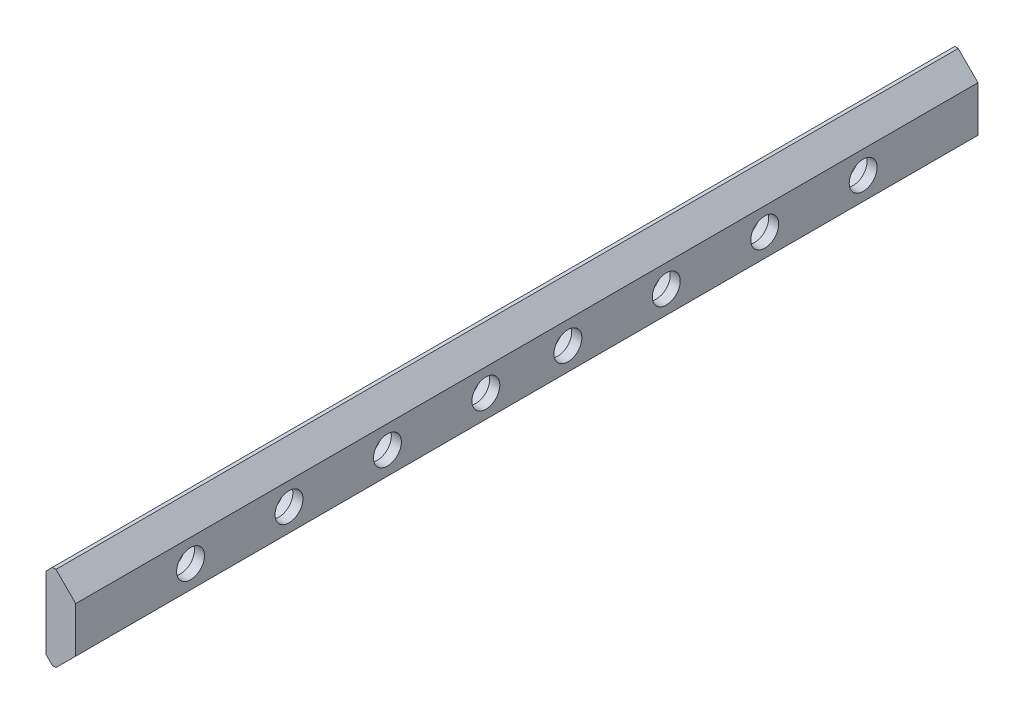
ISO-10303-21;
HEADER;
FILE_DESCRIPTION(('STEP AP214'),'2;1');
FILE_NAME('part.step','',(''),(''),'','','');
FILE_SCHEMA(('AUTOMOTIVE_DESIGN { 1 0 10303 214 1 1 1 1 }'));
ENDSEC;
DATA;
#1=APPLICATION_CONTEXT('core data for automotive mechanical design processes');
#2=APPLICATION_PROTOCOL_DEFINITION('international standard','automotive_design',2000,#1);
#3=PRODUCT_CONTEXT('',#1,'mechanical');
#4=PRODUCT('Part','Part','',(#3));
#5=PRODUCT_RELATED_PRODUCT_CATEGORY('part','',(#4));
#6=PRODUCT_DEFINITION_FORMATION('','',#4);
#7=PRODUCT_DEFINITION_CONTEXT('part definition',#1,'design');
#8=PRODUCT_DEFINITION('design','',#6,#7);
#9=PRODUCT_DEFINITION_SHAPE('','',#8);
#10=(LENGTH_UNIT() NAMED_UNIT(*) SI_UNIT(.MILLI.,.METRE.));
#11=(NAMED_UNIT(*) PLANE_ANGLE_UNIT() SI_UNIT($,.RADIAN.));
#12=(NAMED_UNIT(*) SI_UNIT($,.STERADIAN.) SOLID_ANGLE_UNIT());
#13=UNCERTAINTY_MEASURE_WITH_UNIT(LENGTH_MEASURE(1.E-05),#10,'distance_accuracy_value','');
#14=(GEOMETRIC_REPRESENTATION_CONTEXT(3) GLOBAL_UNCERTAINTY_ASSIGNED_CONTEXT((#13)) GLOBAL_UNIT_ASSIGNED_CONTEXT((#10,
#11,#12)) REPRESENTATION_CONTEXT('',''));
#15=CARTESIAN_POINT('',(0.,0.,0.));
#16=DIRECTION('',(0.,0.,1.));
#17=DIRECTION('',(1.,0.,0.));
#18=AXIS2_PLACEMENT_3D('',#15,#16,#17);
#19=CARTESIAN_POINT('',(-1.8125,5.4,110.));
#20=DIRECTION('',(1.,0.,0.));
#21=DIRECTION('',(0.,1.,0.));
#22=AXIS2_PLACEMENT_3D('',#19,#20,#21);
#23=PLANE('',#22);
#24=CARTESIAN_POINT('',(-1.8125,0.,50.));
#25=DIRECTION('',(-1.,0.,0.));
#26=DIRECTION('',(0.,0.,1.));
#27=AXIS2_PLACEMENT_3D('',#24,#25,#26);
#28=CIRCLE('',#27,3.5);
#29=CARTESIAN_POINT('',(-1.8125,0.,53.5));
#30=VERTEX_POINT('',#29);
#31=EDGE_CURVE('E124',#30,#30,#28,.T.);
#32=ORIENTED_EDGE('',*,*,#31,.F.);
#33=EDGE_LOOP('',(#32));
#34=FACE_BOUND('',#33,.T.);
#35=CARTESIAN_POINT('',(-1.8125,0.,38.));
#36=DIRECTION('',(-1.,0.,0.));
#37=DIRECTION('',(0.,0.,1.));
#38=AXIS2_PLACEMENT_3D('',#35,#36,#37);
#39=CIRCLE('',#38,3.5);
#40=CARTESIAN_POINT('',(-1.8125,0.,41.5));
#41=VERTEX_POINT('',#40);
#42=EDGE_CURVE('E200',#41,#41,#39,.T.);
#43=ORIENTED_EDGE('',*,*,#42,.F.);
#44=EDGE_LOOP('',(#43));
#45=FACE_BOUND('',#44,.T.);
#46=CARTESIAN_POINT('',(-1.8125,-1.67912299302914E-13,26.));
#47=DIRECTION('',(-1.,0.,0.));
#48=DIRECTION('',(0.,0.,1.));
#49=AXIS2_PLACEMENT_3D('',#46,#47,#48);
#50=CIRCLE('',#49,3.5);
#51=CARTESIAN_POINT('',(-1.8125,-1.67912299302914E-13,29.5));
#52=VERTEX_POINT('',#51);
#53=EDGE_CURVE('E194',#52,#52,#50,.T.);
#54=ORIENTED_EDGE('',*,*,#53,.F.);
#55=EDGE_LOOP('',(#54));
#56=FACE_BOUND('',#55,.T.);
#57=CARTESIAN_POINT('',(-1.8125,-2.51707851435149E-13,14.));
#58=DIRECTION('',(-1.,0.,0.));
#59=DIRECTION('',(0.,0.,1.));
#60=AXIS2_PLACEMENT_3D('',#57,#58,#59);
#61=CIRCLE('',#60,3.5);
#62=CARTESIAN_POINT('',(-1.8125,-2.51707851435149E-13,17.5));
#63=VERTEX_POINT('',#62);
#64=EDGE_CURVE('E188',#63,#63,#61,.T.);
#65=ORIENTED_EDGE('',*,*,#64,.F.);
#66=EDGE_LOOP('',(#65));
#67=FACE_BOUND('',#66,.T.);
#68=CARTESIAN_POINT('',(-1.8125,0.,72.));
#69=DIRECTION('',(-1.,0.,0.));
#70=DIRECTION('',(0.,0.,1.));
#71=AXIS2_PLACEMENT_3D('',#68,#69,#70);
#72=CIRCLE('',#71,3.5);
#73=CARTESIAN_POINT('',(-1.8125,0.,75.5));
#74=VERTEX_POINT('',#73);
#75=EDGE_CURVE('E182',#74,#74,#72,.T.);
#76=ORIENTED_EDGE('',*,*,#75,.F.);
#77=EDGE_LOOP('',(#76));
#78=FACE_BOUND('',#77,.T.);
#79=CARTESIAN_POINT('',(-1.8125,-1.60809347867859E-13,84.));
#80=DIRECTION('',(-1.,0.,0.));
#81=DIRECTION('',(0.,0.,1.));
#82=AXIS2_PLACEMENT_3D('',#79,#80,#81);
#83=CIRCLE('',#82,3.5);
#84=CARTESIAN_POINT('',(-1.8125,-1.60809347867859E-13,87.5));
#85=VERTEX_POINT('',#84);
#86=EDGE_CURVE('E176',#85,#85,#83,.T.);
#87=ORIENTED_EDGE('',*,*,#86,.F.);
#88=EDGE_LOOP('',(#87));
#89=FACE_BOUND('',#88,.T.);
#90=CARTESIAN_POINT('',(-1.8125,-2.41665747682141E-13,96.));
#91=DIRECTION('',(-1.,0.,0.));
#92=DIRECTION('',(0.,0.,1.));
#93=AXIS2_PLACEMENT_3D('',#90,#91,#92);
#94=CIRCLE('',#93,3.5);
#95=CARTESIAN_POINT('',(-1.8125,-2.41665747682141E-13,99.5));
#96=VERTEX_POINT('',#95);
#97=EDGE_CURVE('E170',#96,#96,#94,.T.);
#98=ORIENTED_EDGE('',*,*,#97,.F.);
#99=EDGE_LOOP('',(#98));
#100=FACE_BOUND('',#99,.T.);
#101=CARTESIAN_POINT('',(-1.8125,0.,60.));
#102=DIRECTION('',(-1.,0.,0.));
#103=DIRECTION('',(0.,0.,1.));
#104=AXIS2_PLACEMENT_3D('',#101,#102,#103);
#105=CIRCLE('',#104,3.5);
#106=CARTESIAN_POINT('',(-1.8125,0.,63.5));
#107=VERTEX_POINT('',#106);
#108=EDGE_CURVE('E164',#107,#107,#105,.T.);
#109=ORIENTED_EDGE('',*,*,#108,.F.);
#110=EDGE_LOOP('',(#109));
#111=FACE_BOUND('',#110,.T.);
#112=DIRECTION('',(0.,-1.,0.));
#113=VECTOR('',#112,1.);
#114=CARTESIAN_POINT('',(-1.8125,5.4,110.));
#115=LINE('',#114,#113);
#116=CARTESIAN_POINT('',(-1.8125,4.40000000000001,110.));
#117=VERTEX_POINT('',#116);
#118=CARTESIAN_POINT('',(-1.8125,-4.40000000000001,110.));
#119=VERTEX_POINT('',#118);
#120=EDGE_CURVE('E122',#117,#119,#115,.T.);
#121=ORIENTED_EDGE('',*,*,#120,.F.);
#122=DIRECTION('',(0.,0.,1.));
#123=VECTOR('',#122,1.);
#124=CARTESIAN_POINT('',(-1.8125,4.40000000000001,0.));
#125=LINE('',#124,#123);
#126=CARTESIAN_POINT('',(-1.8125,4.40000000000001,0.));
#127=VERTEX_POINT('',#126);
#128=EDGE_CURVE('E109',#127,#117,#125,.T.);
#129=ORIENTED_EDGE('',*,*,#128,.F.);
#130=DIRECTION('',(0.,-1.,0.));
#131=VECTOR('',#130,1.);
#132=CARTESIAN_POINT('',(-1.8125,5.4,0.));
#133=LINE('',#132,#131);
#134=CARTESIAN_POINT('',(-1.8125,-4.4,0.));
#135=VERTEX_POINT('',#134);
#136=EDGE_CURVE('E120',#127,#135,#133,.T.);
#137=ORIENTED_EDGE('',*,*,#136,.T.);
#138=DIRECTION('',(0.,0.,1.));
#139=VECTOR('',#138,1.);
#140=CARTESIAN_POINT('',(-1.8125,-4.40000000000001,0.));
#141=LINE('',#140,#139);
#142=EDGE_CURVE('E309',#135,#119,#141,.T.);
#143=ORIENTED_EDGE('',*,*,#142,.T.);
#144=EDGE_LOOP('',(#121,#129,#137,#143));
#145=FACE_BOUND('',#144,.T.);
#146=ADVANCED_FACE('F39',(#34,#45,#56,#67,#78,#89,#100,#111,#145),#23,.F.);
#147=CARTESIAN_POINT('',(1.8125,-2.775,110.));
#148=DIRECTION('',(-0.707106781186548,0.707106781186547,0.));
#149=DIRECTION('',(-0.707106781186547,-0.707106781186548,0.));
#150=AXIS2_PLACEMENT_3D('',#147,#148,#149);
#151=PLANE('',#150);
#152=DIRECTION('',(0.707106781186547,0.707106781186548,0.));
#153=VECTOR('',#152,1.);
#154=CARTESIAN_POINT('',(1.8125,-2.775,110.));
#155=LINE('',#154,#153);
#156=CARTESIAN_POINT('',(-0.60036796564403,-5.18786796564403,110.));
#157=VERTEX_POINT('',#156);
#158=CARTESIAN_POINT('',(1.8125,-2.775,110.));
#159=VERTEX_POINT('',#158);
#160=EDGE_CURVE('E223',#157,#159,#155,.T.);
#161=ORIENTED_EDGE('',*,*,#160,.F.);
#162=DIRECTION('',(0.,0.,-1.));
#163=VECTOR('',#162,1.);
#164=CARTESIAN_POINT('',(-0.600367965644031,-5.18786796564403,110.));
#165=LINE('',#164,#163);
#166=CARTESIAN_POINT('',(-0.60036796564403,-5.18786796564403,0.));
#167=VERTEX_POINT('',#166);
#168=EDGE_CURVE('E158',#157,#167,#165,.T.);
#169=ORIENTED_EDGE('',*,*,#168,.T.);
#170=DIRECTION('',(0.707106781186547,0.707106781186548,0.));
#171=VECTOR('',#170,1.);
#172=CARTESIAN_POINT('',(1.8125,-2.775,0.));
#173=LINE('',#172,#171);
#174=CARTESIAN_POINT('',(1.8125,-2.775,0.));
#175=VERTEX_POINT('',#174);
#176=EDGE_CURVE('E132',#167,#175,#173,.T.);
#177=ORIENTED_EDGE('',*,*,#176,.T.);
#178=DIRECTION('',(0.,0.,-1.));
#179=VECTOR('',#178,1.);
#180=CARTESIAN_POINT('',(1.8125,-2.775,110.));
#181=LINE('',#180,#179);
#182=EDGE_CURVE('E155',#159,#175,#181,.T.);
#183=ORIENTED_EDGE('',*,*,#182,.F.);
#184=EDGE_LOOP('',(#161,#169,#177,#183));
#185=FACE_BOUND('',#184,.T.);
#186=ADVANCED_FACE('F329',(#185),#151,.F.);
#187=CARTESIAN_POINT('',(1.8125,2.775,110.));
#188=DIRECTION('',(-1.,0.,0.));
#189=DIRECTION('',(0.,-1.,0.));
#190=AXIS2_PLACEMENT_3D('',#187,#188,#189);
#191=PLANE('',#190);
#192=CARTESIAN_POINT('',(1.8125,0.,50.));
#193=DIRECTION('',(-1.,0.,0.));
#194=DIRECTION('',(0.,-1.,0.));
#195=AXIS2_PLACEMENT_3D('',#192,#193,#194);
#196=CIRCLE('',#195,1.7);
#197=CARTESIAN_POINT('',(1.8125,-1.7,50.));
#198=VERTEX_POINT('',#197);
#199=EDGE_CURVE('E196',#198,#198,#196,.T.);
#200=ORIENTED_EDGE('',*,*,#199,.T.);
#201=EDGE_LOOP('',(#200));
#202=FACE_BOUND('',#201,.T.);
#203=CARTESIAN_POINT('',(1.8125,0.,38.));
#204=DIRECTION('',(-1.,0.,0.));
#205=DIRECTION('',(0.,-1.,0.));
#206=AXIS2_PLACEMENT_3D('',#203,#204,#205);
#207=CIRCLE('',#206,1.7);
#208=CARTESIAN_POINT('',(1.8125,-1.70000000000008,38.));
#209=VERTEX_POINT('',#208);
#210=EDGE_CURVE('E190',#209,#209,#207,.T.);
#211=ORIENTED_EDGE('',*,*,#210,.T.);
#212=EDGE_LOOP('',(#211));
#213=FACE_BOUND('',#212,.T.);
#214=CARTESIAN_POINT('',(1.8125,-1.67912299302914E-13,26.));
#215=DIRECTION('',(-1.,0.,0.));
#216=DIRECTION('',(0.,-1.,0.));
#217=AXIS2_PLACEMENT_3D('',#214,#215,#216);
#218=CIRCLE('',#217,1.7);
#219=CARTESIAN_POINT('',(1.8125,-1.70000000000017,26.));
#220=VERTEX_POINT('',#219);
#221=EDGE_CURVE('E184',#220,#220,#218,.T.);
#222=ORIENTED_EDGE('',*,*,#221,.T.);
#223=EDGE_LOOP('',(#222));
#224=FACE_BOUND('',#223,.T.);
#225=CARTESIAN_POINT('',(1.8125,-2.51707851435149E-13,14.));
#226=DIRECTION('',(-1.,0.,0.));
#227=DIRECTION('',(0.,-1.,0.));
#228=AXIS2_PLACEMENT_3D('',#225,#226,#227);
#229=CIRCLE('',#228,1.7);
#230=CARTESIAN_POINT('',(1.8125,-1.70000000000025,14.));
#231=VERTEX_POINT('',#230);
#232=EDGE_CURVE('E178',#231,#231,#229,.T.);
#233=ORIENTED_EDGE('',*,*,#232,.T.);
#234=EDGE_LOOP('',(#233));
#235=FACE_BOUND('',#234,.T.);
#236=CARTESIAN_POINT('',(1.8125,0.,72.));
#237=DIRECTION('',(-1.,0.,0.));
#238=DIRECTION('',(0.,-1.,0.));
#239=AXIS2_PLACEMENT_3D('',#236,#237,#238);
#240=CIRCLE('',#239,1.7);
#241=CARTESIAN_POINT('',(1.8125,-1.70000000000008,72.));
#242=VERTEX_POINT('',#241);
#243=EDGE_CURVE('E172',#242,#242,#240,.T.);
#244=ORIENTED_EDGE('',*,*,#243,.T.);
#245=EDGE_LOOP('',(#244));
#246=FACE_BOUND('',#245,.T.);
#247=CARTESIAN_POINT('',(1.8125,-1.60809347867859E-13,84.));
#248=DIRECTION('',(-1.,0.,0.));
#249=DIRECTION('',(0.,-1.,0.));
#250=AXIS2_PLACEMENT_3D('',#247,#248,#249);
#251=CIRCLE('',#250,1.7);
#252=CARTESIAN_POINT('',(1.8125,-1.70000000000016,84.));
#253=VERTEX_POINT('',#252);
#254=EDGE_CURVE('E166',#253,#253,#251,.T.);
#255=ORIENTED_EDGE('',*,*,#254,.T.);
#256=EDGE_LOOP('',(#255));
#257=FACE_BOUND('',#256,.T.);
#258=CARTESIAN_POINT('',(1.8125,-2.41665747682141E-13,96.));
#259=DIRECTION('',(-1.,0.,0.));
#260=DIRECTION('',(0.,-1.,0.));
#261=AXIS2_PLACEMENT_3D('',#258,#259,#260);
#262=CIRCLE('',#261,1.7);
#263=CARTESIAN_POINT('',(1.8125,-1.70000000000024,96.));
#264=VERTEX_POINT('',#263);
#265=EDGE_CURVE('E160',#264,#264,#262,.T.);
#266=ORIENTED_EDGE('',*,*,#265,.T.);
#267=EDGE_LOOP('',(#266));
#268=FACE_BOUND('',#267,.T.);
#269=CARTESIAN_POINT('',(1.8125,0.,60.));
#270=DIRECTION('',(-1.,0.,0.));
#271=DIRECTION('',(0.,-1.,0.));
#272=AXIS2_PLACEMENT_3D('',#269,#270,#271);
#273=CIRCLE('',#272,1.7);
#274=CARTESIAN_POINT('',(1.8125,-1.7,60.));
#275=VERTEX_POINT('',#274);
#276=EDGE_CURVE('E133',#275,#275,#273,.T.);
#277=ORIENTED_EDGE('',*,*,#276,.T.);
#278=EDGE_LOOP('',(#277));
#279=FACE_BOUND('',#278,.T.);
#280=DIRECTION('',(0.,1.,0.));
#281=VECTOR('',#280,1.);
#282=CARTESIAN_POINT('',(1.8125,2.775,0.));
#283=LINE('',#282,#281);
#284=CARTESIAN_POINT('',(1.8125,2.775,0.));
#285=VERTEX_POINT('',#284);
#286=EDGE_CURVE('E137',#175,#285,#283,.T.);
#287=ORIENTED_EDGE('',*,*,#286,.T.);
#288=DIRECTION('',(0.,0.,-1.));
#289=VECTOR('',#288,1.);
#290=CARTESIAN_POINT('',(1.8125,2.775,110.));
#291=LINE('',#290,#289);
#292=CARTESIAN_POINT('',(1.8125,2.775,110.));
#293=VERTEX_POINT('',#292);
#294=EDGE_CURVE('E151',#293,#285,#291,.T.);
#295=ORIENTED_EDGE('',*,*,#294,.F.);
#296=DIRECTION('',(0.,1.,0.));
#297=VECTOR('',#296,1.);
#298=CARTESIAN_POINT('',(1.8125,2.775,110.));
#299=LINE('',#298,#297);
#300=EDGE_CURVE('E221',#159,#293,#299,.T.);
#301=ORIENTED_EDGE('',*,*,#300,.F.);
#302=ORIENTED_EDGE('',*,*,#182,.T.);
#303=EDGE_LOOP('',(#287,#295,#301,#302));
#304=FACE_BOUND('',#303,.T.);
#305=ADVANCED_FACE('F325',(#202,#213,#224,#235,#246,#257,#268,#279,#304),#191,.F.);
#306=CARTESIAN_POINT('',(-0.812499999999997,5.4,110.));
#307=DIRECTION('',(-0.707106781186548,-0.707106781186547,0.));
#308=DIRECTION('',(0.707106781186547,-0.707106781186548,0.));
#309=AXIS2_PLACEMENT_3D('',#306,#307,#308);
#310=PLANE('',#309);
#311=DIRECTION('',(-0.707106781186547,0.707106781186548,0.));
#312=VECTOR('',#311,1.);
#313=CARTESIAN_POINT('',(-0.812499999999997,5.4,0.));
#314=LINE('',#313,#312);
#315=CARTESIAN_POINT('',(-0.600367965644039,5.18786796564404,0.));
#316=VERTEX_POINT('',#315);
#317=EDGE_CURVE('E148',#285,#316,#314,.T.);
#318=ORIENTED_EDGE('',*,*,#317,.T.);
#319=DIRECTION('',(0.,0.,1.));
#320=VECTOR('',#319,1.);
#321=CARTESIAN_POINT('',(-0.600367965644039,5.18786796564404,110.));
#322=LINE('',#321,#320);
#323=CARTESIAN_POINT('',(-0.600367965644039,5.18786796564404,110.));
#324=VERTEX_POINT('',#323);
#325=EDGE_CURVE('E11',#316,#324,#322,.T.);
#326=ORIENTED_EDGE('',*,*,#325,.T.);
#327=DIRECTION('',(-0.707106781186547,0.707106781186548,0.));
#328=VECTOR('',#327,1.);
#329=CARTESIAN_POINT('',(-0.812499999999997,5.4,110.));
#330=LINE('',#329,#328);
#331=EDGE_CURVE('E143',#293,#324,#330,.T.);
#332=ORIENTED_EDGE('',*,*,#331,.F.);
#333=ORIENTED_EDGE('',*,*,#294,.T.);
#334=EDGE_LOOP('',(#318,#326,#332,#333));
#335=FACE_BOUND('',#334,.T.);
#336=ADVANCED_FACE('F321',(#335),#310,.F.);
#337=CARTESIAN_POINT('',(0.,0.,110.));
#338=DIRECTION('',(0.,0.,-1.));
#339=DIRECTION('',(-1.,0.,0.));
#340=AXIS2_PLACEMENT_3D('',#337,#338,#339);
#341=PLANE('',#340);
#342=DIRECTION('',(-0.70710678118655,0.707106781186545,0.));
#343=VECTOR('',#342,1.);
#344=CARTESIAN_POINT('',(-0.812499999999997,-5.4,110.));
#345=LINE('',#344,#343);
#346=CARTESIAN_POINT('',(-1.02463203435596,-5.18786796564403,110.));
#347=VERTEX_POINT('',#346);
#348=EDGE_CURVE('E312',#347,#119,#345,.T.);
#349=ORIENTED_EDGE('',*,*,#348,.F.);
#350=DIRECTION('',(-1.,0.,0.));
#351=VECTOR('',#350,1.);
#352=CARTESIAN_POINT('',(-0.600367965644032,-5.18786796564403,110.));
#353=LINE('',#352,#351);
#354=EDGE_CURVE('E216',#347,#157,#353,.F.);
#355=ORIENTED_EDGE('',*,*,#354,.T.);
#356=ORIENTED_EDGE('',*,*,#160,.T.);
#357=ORIENTED_EDGE('',*,*,#300,.T.);
#358=ORIENTED_EDGE('',*,*,#331,.T.);
#359=DIRECTION('',(1.,0.,0.));
#360=VECTOR('',#359,1.);
#361=CARTESIAN_POINT('',(-1.02463203435596,5.18786796564404,110.));
#362=LINE('',#361,#360);
#363=CARTESIAN_POINT('',(-1.02463203435596,5.18786796564404,110.));
#364=VERTEX_POINT('',#363);
#365=EDGE_CURVE('E55',#324,#364,#362,.F.);
#366=ORIENTED_EDGE('',*,*,#365,.T.);
#367=DIRECTION('',(0.707106781186551,0.707106781186544,0.));
#368=VECTOR('',#367,1.);
#369=CARTESIAN_POINT('',(-0.812499999999997,5.4,110.));
#370=LINE('',#369,#368);
#371=EDGE_CURVE('E114',#117,#364,#370,.T.);
#372=ORIENTED_EDGE('',*,*,#371,.F.);
#373=ORIENTED_EDGE('',*,*,#120,.T.);
#374=EDGE_LOOP('',(#349,#355,#356,#357,#358,#366,#372,#373));
#375=FACE_BOUND('',#374,.T.);
#376=ADVANCED_FACE('F337',(#375),#341,.F.);
#377=CARTESIAN_POINT('',(0.,0.,0.));
#378=DIRECTION('',(0.,0.,-1.));
#379=DIRECTION('',(-1.,0.,0.));
#380=AXIS2_PLACEMENT_3D('',#377,#378,#379);
#381=PLANE('',#380);
#382=ORIENTED_EDGE('',*,*,#176,.F.);
#383=DIRECTION('',(1.,0.,0.));
#384=VECTOR('',#383,1.);
#385=CARTESIAN_POINT('',(0.,-5.18786796564403,0.));
#386=LINE('',#385,#384);
#387=CARTESIAN_POINT('',(-1.02463203435596,-5.18786796564403,0.));
#388=VERTEX_POINT('',#387);
#389=EDGE_CURVE('E208',#167,#388,#386,.F.);
#390=ORIENTED_EDGE('',*,*,#389,.T.);
#391=DIRECTION('',(-0.70710678118655,0.707106781186545,0.));
#392=VECTOR('',#391,1.);
#393=CARTESIAN_POINT('',(-0.812499999999997,-5.4,0.));
#394=LINE('',#393,#392);
#395=EDGE_CURVE('E129',#388,#135,#394,.T.);
#396=ORIENTED_EDGE('',*,*,#395,.T.);
#397=ORIENTED_EDGE('',*,*,#136,.F.);
#398=DIRECTION('',(0.707106781186551,0.707106781186544,0.));
#399=VECTOR('',#398,1.);
#400=CARTESIAN_POINT('',(-0.812499999999997,5.4,0.));
#401=LINE('',#400,#399);
#402=CARTESIAN_POINT('',(-1.02463203435596,5.18786796564404,0.));
#403=VERTEX_POINT('',#402);
#404=EDGE_CURVE('E106',#127,#403,#401,.T.);
#405=ORIENTED_EDGE('',*,*,#404,.T.);
#406=DIRECTION('',(-1.,0.,0.));
#407=VECTOR('',#406,1.);
#408=CARTESIAN_POINT('',(0.,5.18786796564404,0.));
#409=LINE('',#408,#407);
#410=EDGE_CURVE('E205',#403,#316,#409,.F.);
#411=ORIENTED_EDGE('',*,*,#410,.T.);
#412=ORIENTED_EDGE('',*,*,#317,.F.);
#413=ORIENTED_EDGE('',*,*,#286,.F.);
#414=EDGE_LOOP('',(#382,#390,#396,#397,#405,#411,#412,#413));
#415=FACE_BOUND('',#414,.T.);
#416=ADVANCED_FACE('F127',(#415),#381,.T.);
#417=CARTESIAN_POINT('',(-1.8125,0.,60.));
#418=DIRECTION('',(-1.,0.,0.));
#419=DIRECTION('',(0.,0.,1.));
#420=AXIS2_PLACEMENT_3D('',#417,#418,#419);
#421=CYLINDRICAL_SURFACE('',#420,1.7);
#422=CARTESIAN_POINT('',(0.587500000000001,0.,60.));
#423=DIRECTION('',(-1.,0.,0.));
#424=DIRECTION('',(0.,0.,1.));
#425=AXIS2_PLACEMENT_3D('',#422,#423,#424);
#426=CIRCLE('',#425,1.7);
#427=CARTESIAN_POINT('',(0.587500000000001,0.,61.7));
#428=VERTEX_POINT('',#427);
#429=EDGE_CURVE('E140',#428,#428,#426,.T.);
#430=ORIENTED_EDGE('',*,*,#429,.T.);
#431=EDGE_LOOP('',(#430));
#432=FACE_BOUND('',#431,.T.);
#433=ORIENTED_EDGE('',*,*,#276,.F.);
#434=EDGE_LOOP('',(#433));
#435=FACE_BOUND('',#434,.T.);
#436=ADVANCED_FACE('F344',(#432,#435),#421,.F.);
#437=CARTESIAN_POINT('',(0.587500000000001,1.7,60.));
#438=DIRECTION('',(1.,0.,0.));
#439=DIRECTION('',(0.,0.,-1.));
#440=AXIS2_PLACEMENT_3D('',#437,#438,#439);
#441=PLANE('',#440);
#442=ORIENTED_EDGE('',*,*,#429,.F.);
#443=EDGE_LOOP('',(#442));
#444=FACE_BOUND('',#443,.T.);
#445=CARTESIAN_POINT('',(0.587500000000001,0.,60.));
#446=DIRECTION('',(-1.,0.,0.));
#447=DIRECTION('',(0.,0.,1.));
#448=AXIS2_PLACEMENT_3D('',#445,#446,#447);
#449=CIRCLE('',#448,3.5);
#450=CARTESIAN_POINT('',(0.587500000000001,0.,63.5));
#451=VERTEX_POINT('',#450);
#452=EDGE_CURVE('E232',#451,#451,#449,.T.);
#453=ORIENTED_EDGE('',*,*,#452,.T.);
#454=EDGE_LOOP('',(#453));
#455=FACE_BOUND('',#454,.T.);
#456=ADVANCED_FACE('F456',(#444,#455),#441,.F.);
#457=CARTESIAN_POINT('',(-1.8125,0.,60.));
#458=DIRECTION('',(-1.,0.,0.));
#459=DIRECTION('',(0.,0.,1.));
#460=AXIS2_PLACEMENT_3D('',#457,#458,#459);
#461=CYLINDRICAL_SURFACE('',#460,3.5);
#462=ORIENTED_EDGE('',*,*,#452,.F.);
#463=EDGE_LOOP('',(#462));
#464=FACE_BOUND('',#463,.T.);
#465=ORIENTED_EDGE('',*,*,#108,.T.);
#466=EDGE_LOOP('',(#465));
#467=FACE_BOUND('',#466,.T.);
#468=ADVANCED_FACE('F452',(#464,#467),#461,.F.);
#469=CARTESIAN_POINT('',(-1.8125,-2.41665747682141E-13,96.));
#470=DIRECTION('',(-1.,0.,0.));
#471=DIRECTION('',(0.,0.,1.));
#472=AXIS2_PLACEMENT_3D('',#469,#470,#471);
#473=CYLINDRICAL_SURFACE('',#472,1.7);
#474=CARTESIAN_POINT('',(0.587500000000001,-2.41665747682141E-13,96.));
#475=DIRECTION('',(-1.,0.,0.));
#476=DIRECTION('',(0.,0.,1.));
#477=AXIS2_PLACEMENT_3D('',#474,#475,#476);
#478=CIRCLE('',#477,1.7);
#479=CARTESIAN_POINT('',(0.587500000000001,-2.41665747682141E-13,97.7));
#480=VERTEX_POINT('',#479);
#481=EDGE_CURVE('E165',#480,#480,#478,.T.);
#482=ORIENTED_EDGE('',*,*,#481,.T.);
#483=EDGE_LOOP('',(#482));
#484=FACE_BOUND('',#483,.T.);
#485=ORIENTED_EDGE('',*,*,#265,.F.);
#486=EDGE_LOOP('',(#485));
#487=FACE_BOUND('',#486,.T.);
#488=ADVANCED_FACE('F448',(#484,#487),#473,.F.);
#489=CARTESIAN_POINT('',(0.587500000000001,1.69999999999976,96.));
#490=DIRECTION('',(1.,0.,0.));
#491=DIRECTION('',(0.,0.,-1.));
#492=AXIS2_PLACEMENT_3D('',#489,#490,#491);
#493=PLANE('',#492);
#494=ORIENTED_EDGE('',*,*,#481,.F.);
#495=EDGE_LOOP('',(#494));
#496=FACE_BOUND('',#495,.T.);
#497=CARTESIAN_POINT('',(0.587500000000001,-2.41665747682141E-13,96.));
#498=DIRECTION('',(-1.,0.,0.));
#499=DIRECTION('',(0.,0.,1.));
#500=AXIS2_PLACEMENT_3D('',#497,#498,#499);
#501=CIRCLE('',#500,3.5);
#502=CARTESIAN_POINT('',(0.587500000000001,-2.41665747682141E-13,99.5));
#503=VERTEX_POINT('',#502);
#504=EDGE_CURVE('E242',#503,#503,#501,.T.);
#505=ORIENTED_EDGE('',*,*,#504,.T.);
#506=EDGE_LOOP('',(#505));
#507=FACE_BOUND('',#506,.T.);
#508=ADVANCED_FACE('F444',(#496,#507),#493,.F.);
#509=CARTESIAN_POINT('',(-1.8125,-2.41665747682141E-13,96.));
#510=DIRECTION('',(-1.,0.,0.));
#511=DIRECTION('',(0.,0.,1.));
#512=AXIS2_PLACEMENT_3D('',#509,#510,#511);
#513=CYLINDRICAL_SURFACE('',#512,3.5);
#514=ORIENTED_EDGE('',*,*,#504,.F.);
#515=EDGE_LOOP('',(#514));
#516=FACE_BOUND('',#515,.T.);
#517=ORIENTED_EDGE('',*,*,#97,.T.);
#518=EDGE_LOOP('',(#517));
#519=FACE_BOUND('',#518,.T.);
#520=ADVANCED_FACE('F440',(#516,#519),#513,.F.);
#521=CARTESIAN_POINT('',(-1.8125,-1.60809347867859E-13,84.));
#522=DIRECTION('',(-1.,0.,0.));
#523=DIRECTION('',(0.,0.,1.));
#524=AXIS2_PLACEMENT_3D('',#521,#522,#523);
#525=CYLINDRICAL_SURFACE('',#524,1.7);
#526=CARTESIAN_POINT('',(0.587500000000001,-1.60809347867859E-13,84.));
#527=DIRECTION('',(-1.,0.,0.));
#528=DIRECTION('',(0.,0.,1.));
#529=AXIS2_PLACEMENT_3D('',#526,#527,#528);
#530=CIRCLE('',#529,1.7);
#531=CARTESIAN_POINT('',(0.587500000000001,-1.60809347867859E-13,85.7));
#532=VERTEX_POINT('',#531);
#533=EDGE_CURVE('E171',#532,#532,#530,.T.);
#534=ORIENTED_EDGE('',*,*,#533,.T.);
#535=EDGE_LOOP('',(#534));
#536=FACE_BOUND('',#535,.T.);
#537=ORIENTED_EDGE('',*,*,#254,.F.);
#538=EDGE_LOOP('',(#537));
#539=FACE_BOUND('',#538,.T.);
#540=ADVANCED_FACE('F436',(#536,#539),#525,.F.);
#541=CARTESIAN_POINT('',(0.587500000000001,1.69999999999984,84.));
#542=DIRECTION('',(1.,0.,0.));
#543=DIRECTION('',(0.,0.,-1.));
#544=AXIS2_PLACEMENT_3D('',#541,#542,#543);
#545=PLANE('',#544);
#546=ORIENTED_EDGE('',*,*,#533,.F.);
#547=EDGE_LOOP('',(#546));
#548=FACE_BOUND('',#547,.T.);
#549=CARTESIAN_POINT('',(0.587500000000001,-1.60809347867859E-13,84.));
#550=DIRECTION('',(-1.,0.,0.));
#551=DIRECTION('',(0.,0.,1.));
#552=AXIS2_PLACEMENT_3D('',#549,#550,#551);
#553=CIRCLE('',#552,3.5);
#554=CARTESIAN_POINT('',(0.587500000000001,-1.60809347867859E-13,87.5));
#555=VERTEX_POINT('',#554);
#556=EDGE_CURVE('E252',#555,#555,#553,.T.);
#557=ORIENTED_EDGE('',*,*,#556,.T.);
#558=EDGE_LOOP('',(#557));
#559=FACE_BOUND('',#558,.T.);
#560=ADVANCED_FACE('F432',(#548,#559),#545,.F.);
#561=CARTESIAN_POINT('',(-1.8125,-1.60809347867859E-13,84.));
#562=DIRECTION('',(-1.,0.,0.));
#563=DIRECTION('',(0.,0.,1.));
#564=AXIS2_PLACEMENT_3D('',#561,#562,#563);
#565=CYLINDRICAL_SURFACE('',#564,3.5);
#566=ORIENTED_EDGE('',*,*,#556,.F.);
#567=EDGE_LOOP('',(#566));
#568=FACE_BOUND('',#567,.T.);
#569=ORIENTED_EDGE('',*,*,#86,.T.);
#570=EDGE_LOOP('',(#569));
#571=FACE_BOUND('',#570,.T.);
#572=ADVANCED_FACE('F428',(#568,#571),#565,.F.);
#573=CARTESIAN_POINT('',(-1.8125,0.,72.));
#574=DIRECTION('',(-1.,0.,0.));
#575=DIRECTION('',(0.,0.,1.));
#576=AXIS2_PLACEMENT_3D('',#573,#574,#575);
#577=CYLINDRICAL_SURFACE('',#576,1.7);
#578=CARTESIAN_POINT('',(0.587500000000001,0.,72.));
#579=DIRECTION('',(-1.,0.,0.));
#580=DIRECTION('',(0.,0.,1.));
#581=AXIS2_PLACEMENT_3D('',#578,#579,#580);
#582=CIRCLE('',#581,1.7);
#583=CARTESIAN_POINT('',(0.587500000000001,0.,73.7));
#584=VERTEX_POINT('',#583);
#585=EDGE_CURVE('E177',#584,#584,#582,.T.);
#586=ORIENTED_EDGE('',*,*,#585,.T.);
#587=EDGE_LOOP('',(#586));
#588=FACE_BOUND('',#587,.T.);
#589=ORIENTED_EDGE('',*,*,#243,.F.);
#590=EDGE_LOOP('',(#589));
#591=FACE_BOUND('',#590,.T.);
#592=ADVANCED_FACE('F424',(#588,#591),#577,.F.);
#593=CARTESIAN_POINT('',(0.587500000000001,1.69999999999992,72.));
#594=DIRECTION('',(1.,0.,0.));
#595=DIRECTION('',(0.,0.,-1.));
#596=AXIS2_PLACEMENT_3D('',#593,#594,#595);
#597=PLANE('',#596);
#598=ORIENTED_EDGE('',*,*,#585,.F.);
#599=EDGE_LOOP('',(#598));
#600=FACE_BOUND('',#599,.T.);
#601=CARTESIAN_POINT('',(0.587500000000001,0.,72.));
#602=DIRECTION('',(-1.,0.,0.));
#603=DIRECTION('',(0.,0.,1.));
#604=AXIS2_PLACEMENT_3D('',#601,#602,#603);
#605=CIRCLE('',#604,3.5);
#606=CARTESIAN_POINT('',(0.587500000000001,0.,75.5));
#607=VERTEX_POINT('',#606);
#608=EDGE_CURVE('E262',#607,#607,#605,.T.);
#609=ORIENTED_EDGE('',*,*,#608,.T.);
#610=EDGE_LOOP('',(#609));
#611=FACE_BOUND('',#610,.T.);
#612=ADVANCED_FACE('F420',(#600,#611),#597,.F.);
#613=CARTESIAN_POINT('',(-1.8125,0.,72.));
#614=DIRECTION('',(-1.,0.,0.));
#615=DIRECTION('',(0.,0.,1.));
#616=AXIS2_PLACEMENT_3D('',#613,#614,#615);
#617=CYLINDRICAL_SURFACE('',#616,3.5);
#618=ORIENTED_EDGE('',*,*,#608,.F.);
#619=EDGE_LOOP('',(#618));
#620=FACE_BOUND('',#619,.T.);
#621=ORIENTED_EDGE('',*,*,#75,.T.);
#622=EDGE_LOOP('',(#621));
#623=FACE_BOUND('',#622,.T.);
#624=ADVANCED_FACE('F416',(#620,#623),#617,.F.);
#625=CARTESIAN_POINT('',(-1.8125,-2.51707851435149E-13,14.));
#626=DIRECTION('',(-1.,0.,0.));
#627=DIRECTION('',(0.,0.,1.));
#628=AXIS2_PLACEMENT_3D('',#625,#626,#627);
#629=CYLINDRICAL_SURFACE('',#628,1.7);
#630=CARTESIAN_POINT('',(0.587500000000001,-2.51707851435149E-13,14.));
#631=DIRECTION('',(-1.,0.,0.));
#632=DIRECTION('',(0.,0.,1.));
#633=AXIS2_PLACEMENT_3D('',#630,#631,#632);
#634=CIRCLE('',#633,1.7);
#635=CARTESIAN_POINT('',(0.587500000000001,-2.51707851435149E-13,15.7));
#636=VERTEX_POINT('',#635);
#637=EDGE_CURVE('E183',#636,#636,#634,.T.);
#638=ORIENTED_EDGE('',*,*,#637,.T.);
#639=EDGE_LOOP('',(#638));
#640=FACE_BOUND('',#639,.T.);
#641=ORIENTED_EDGE('',*,*,#232,.F.);
#642=EDGE_LOOP('',(#641));
#643=FACE_BOUND('',#642,.T.);
#644=ADVANCED_FACE('F412',(#640,#643),#629,.F.);
#645=CARTESIAN_POINT('',(0.587500000000001,1.69999999999975,14.));
#646=DIRECTION('',(1.,0.,0.));
#647=DIRECTION('',(0.,0.,-1.));
#648=AXIS2_PLACEMENT_3D('',#645,#646,#647);
#649=PLANE('',#648);
#650=ORIENTED_EDGE('',*,*,#637,.F.);
#651=EDGE_LOOP('',(#650));
#652=FACE_BOUND('',#651,.T.);
#653=CARTESIAN_POINT('',(0.587500000000001,-2.51707851435149E-13,14.));
#654=DIRECTION('',(-1.,0.,0.));
#655=DIRECTION('',(0.,0.,1.));
#656=AXIS2_PLACEMENT_3D('',#653,#654,#655);
#657=CIRCLE('',#656,3.5);
#658=CARTESIAN_POINT('',(0.587500000000001,-2.51707851435149E-13,17.5));
#659=VERTEX_POINT('',#658);
#660=EDGE_CURVE('E272',#659,#659,#657,.T.);
#661=ORIENTED_EDGE('',*,*,#660,.T.);
#662=EDGE_LOOP('',(#661));
#663=FACE_BOUND('',#662,.T.);
#664=ADVANCED_FACE('F408',(#652,#663),#649,.F.);
#665=CARTESIAN_POINT('',(-1.8125,-2.51707851435149E-13,14.));
#666=DIRECTION('',(-1.,0.,0.));
#667=DIRECTION('',(0.,0.,1.));
#668=AXIS2_PLACEMENT_3D('',#665,#666,#667);
#669=CYLINDRICAL_SURFACE('',#668,3.5);
#670=ORIENTED_EDGE('',*,*,#660,.F.);
#671=EDGE_LOOP('',(#670));
#672=FACE_BOUND('',#671,.T.);
#673=ORIENTED_EDGE('',*,*,#64,.T.);
#674=EDGE_LOOP('',(#673));
#675=FACE_BOUND('',#674,.T.);
#676=ADVANCED_FACE('F404',(#672,#675),#669,.F.);
#677=CARTESIAN_POINT('',(-1.8125,-1.67912299302914E-13,26.));
#678=DIRECTION('',(-1.,0.,0.));
#679=DIRECTION('',(0.,0.,1.));
#680=AXIS2_PLACEMENT_3D('',#677,#678,#679);
#681=CYLINDRICAL_SURFACE('',#680,1.7);
#682=CARTESIAN_POINT('',(0.587500000000001,-1.67912299302914E-13,26.));
#683=DIRECTION('',(-1.,0.,0.));
#684=DIRECTION('',(0.,0.,1.));
#685=AXIS2_PLACEMENT_3D('',#682,#683,#684);
#686=CIRCLE('',#685,1.7);
#687=CARTESIAN_POINT('',(0.587500000000001,-1.67912299302914E-13,27.7));
#688=VERTEX_POINT('',#687);
#689=EDGE_CURVE('E189',#688,#688,#686,.T.);
#690=ORIENTED_EDGE('',*,*,#689,.T.);
#691=EDGE_LOOP('',(#690));
#692=FACE_BOUND('',#691,.T.);
#693=ORIENTED_EDGE('',*,*,#221,.F.);
#694=EDGE_LOOP('',(#693));
#695=FACE_BOUND('',#694,.T.);
#696=ADVANCED_FACE('F400',(#692,#695),#681,.F.);
#697=CARTESIAN_POINT('',(0.587500000000001,1.69999999999983,26.));
#698=DIRECTION('',(1.,0.,0.));
#699=DIRECTION('',(0.,0.,-1.));
#700=AXIS2_PLACEMENT_3D('',#697,#698,#699);
#701=PLANE('',#700);
#702=ORIENTED_EDGE('',*,*,#689,.F.);
#703=EDGE_LOOP('',(#702));
#704=FACE_BOUND('',#703,.T.);
#705=CARTESIAN_POINT('',(0.587500000000001,-1.67912299302914E-13,26.));
#706=DIRECTION('',(-1.,0.,0.));
#707=DIRECTION('',(0.,0.,1.));
#708=AXIS2_PLACEMENT_3D('',#705,#706,#707);
#709=CIRCLE('',#708,3.5);
#710=CARTESIAN_POINT('',(0.587500000000001,-1.67912299302914E-13,29.5));
#711=VERTEX_POINT('',#710);
#712=EDGE_CURVE('E282',#711,#711,#709,.T.);
#713=ORIENTED_EDGE('',*,*,#712,.T.);
#714=EDGE_LOOP('',(#713));
#715=FACE_BOUND('',#714,.T.);
#716=ADVANCED_FACE('F396',(#704,#715),#701,.F.);
#717=CARTESIAN_POINT('',(-1.8125,-1.67912299302914E-13,26.));
#718=DIRECTION('',(-1.,0.,0.));
#719=DIRECTION('',(0.,0.,1.));
#720=AXIS2_PLACEMENT_3D('',#717,#718,#719);
#721=CYLINDRICAL_SURFACE('',#720,3.5);
#722=ORIENTED_EDGE('',*,*,#712,.F.);
#723=EDGE_LOOP('',(#722));
#724=FACE_BOUND('',#723,.T.);
#725=ORIENTED_EDGE('',*,*,#53,.T.);
#726=EDGE_LOOP('',(#725));
#727=FACE_BOUND('',#726,.T.);
#728=ADVANCED_FACE('F392',(#724,#727),#721,.F.);
#729=CARTESIAN_POINT('',(-1.8125,0.,38.));
#730=DIRECTION('',(-1.,0.,0.));
#731=DIRECTION('',(0.,0.,1.));
#732=AXIS2_PLACEMENT_3D('',#729,#730,#731);
#733=CYLINDRICAL_SURFACE('',#732,1.7);
#734=CARTESIAN_POINT('',(0.587500000000001,0.,38.));
#735=DIRECTION('',(-1.,0.,0.));
#736=DIRECTION('',(0.,0.,1.));
#737=AXIS2_PLACEMENT_3D('',#734,#735,#736);
#738=CIRCLE('',#737,1.7);
#739=CARTESIAN_POINT('',(0.587500000000001,0.,39.7));
#740=VERTEX_POINT('',#739);
#741=EDGE_CURVE('E195',#740,#740,#738,.T.);
#742=ORIENTED_EDGE('',*,*,#741,.T.);
#743=EDGE_LOOP('',(#742));
#744=FACE_BOUND('',#743,.T.);
#745=ORIENTED_EDGE('',*,*,#210,.F.);
#746=EDGE_LOOP('',(#745));
#747=FACE_BOUND('',#746,.T.);
#748=ADVANCED_FACE('F388',(#744,#747),#733,.F.);
#749=CARTESIAN_POINT('',(0.587500000000001,1.69999999999991,38.));
#750=DIRECTION('',(1.,0.,0.));
#751=DIRECTION('',(0.,0.,-1.));
#752=AXIS2_PLACEMENT_3D('',#749,#750,#751);
#753=PLANE('',#752);
#754=ORIENTED_EDGE('',*,*,#741,.F.);
#755=EDGE_LOOP('',(#754));
#756=FACE_BOUND('',#755,.T.);
#757=CARTESIAN_POINT('',(0.587500000000001,0.,38.));
#758=DIRECTION('',(-1.,0.,0.));
#759=DIRECTION('',(0.,0.,1.));
#760=AXIS2_PLACEMENT_3D('',#757,#758,#759);
#761=CIRCLE('',#760,3.5);
#762=CARTESIAN_POINT('',(0.587500000000001,0.,41.5));
#763=VERTEX_POINT('',#762);
#764=EDGE_CURVE('E292',#763,#763,#761,.T.);
#765=ORIENTED_EDGE('',*,*,#764,.T.);
#766=EDGE_LOOP('',(#765));
#767=FACE_BOUND('',#766,.T.);
#768=ADVANCED_FACE('F384',(#756,#767),#753,.F.);
#769=CARTESIAN_POINT('',(-1.8125,0.,38.));
#770=DIRECTION('',(-1.,0.,0.));
#771=DIRECTION('',(0.,0.,1.));
#772=AXIS2_PLACEMENT_3D('',#769,#770,#771);
#773=CYLINDRICAL_SURFACE('',#772,3.5);
#774=ORIENTED_EDGE('',*,*,#764,.F.);
#775=EDGE_LOOP('',(#774));
#776=FACE_BOUND('',#775,.T.);
#777=ORIENTED_EDGE('',*,*,#42,.T.);
#778=EDGE_LOOP('',(#777));
#779=FACE_BOUND('',#778,.T.);
#780=ADVANCED_FACE('F380',(#776,#779),#773,.F.);
#781=CARTESIAN_POINT('',(-1.8125,0.,50.));
#782=DIRECTION('',(-1.,0.,0.));
#783=DIRECTION('',(0.,0.,1.));
#784=AXIS2_PLACEMENT_3D('',#781,#782,#783);
#785=CYLINDRICAL_SURFACE('',#784,1.7);
#786=CARTESIAN_POINT('',(0.587500000000001,0.,50.));
#787=DIRECTION('',(-1.,0.,0.));
#788=DIRECTION('',(0.,0.,1.));
#789=AXIS2_PLACEMENT_3D('',#786,#787,#788);
#790=CIRCLE('',#789,1.7);
#791=CARTESIAN_POINT('',(0.587500000000001,0.,51.7));
#792=VERTEX_POINT('',#791);
#793=EDGE_CURVE('E201',#792,#792,#790,.T.);
#794=ORIENTED_EDGE('',*,*,#793,.T.);
#795=EDGE_LOOP('',(#794));
#796=FACE_BOUND('',#795,.T.);
#797=ORIENTED_EDGE('',*,*,#199,.F.);
#798=EDGE_LOOP('',(#797));
#799=FACE_BOUND('',#798,.T.);
#800=ADVANCED_FACE('F376',(#796,#799),#785,.F.);
#801=CARTESIAN_POINT('',(0.587500000000001,1.7,50.));
#802=DIRECTION('',(1.,0.,0.));
#803=DIRECTION('',(0.,0.,-1.));
#804=AXIS2_PLACEMENT_3D('',#801,#802,#803);
#805=PLANE('',#804);
#806=ORIENTED_EDGE('',*,*,#793,.F.);
#807=EDGE_LOOP('',(#806));
#808=FACE_BOUND('',#807,.T.);
#809=CARTESIAN_POINT('',(0.587500000000001,0.,50.));
#810=DIRECTION('',(-1.,0.,0.));
#811=DIRECTION('',(0.,0.,1.));
#812=AXIS2_PLACEMENT_3D('',#809,#810,#811);
#813=CIRCLE('',#812,3.5);
#814=CARTESIAN_POINT('',(0.587500000000001,0.,53.5));
#815=VERTEX_POINT('',#814);
#816=EDGE_CURVE('E302',#815,#815,#813,.T.);
#817=ORIENTED_EDGE('',*,*,#816,.T.);
#818=EDGE_LOOP('',(#817));
#819=FACE_BOUND('',#818,.T.);
#820=ADVANCED_FACE('F372',(#808,#819),#805,.F.);
#821=CARTESIAN_POINT('',(-1.8125,0.,50.));
#822=DIRECTION('',(-1.,0.,0.));
#823=DIRECTION('',(0.,0.,1.));
#824=AXIS2_PLACEMENT_3D('',#821,#822,#823);
#825=CYLINDRICAL_SURFACE('',#824,3.5);
#826=ORIENTED_EDGE('',*,*,#816,.F.);
#827=EDGE_LOOP('',(#826));
#828=FACE_BOUND('',#827,.T.);
#829=ORIENTED_EDGE('',*,*,#31,.T.);
#830=EDGE_LOOP('',(#829));
#831=FACE_BOUND('',#830,.T.);
#832=ADVANCED_FACE('F367',(#828,#831),#825,.F.);
#833=CARTESIAN_POINT('',(-0.812499999999997,-5.4,0.));
#834=DIRECTION('',(0.707106781186545,0.70710678118655,0.));
#835=DIRECTION('',(-0.70710678118655,0.707106781186545,0.));
#836=AXIS2_PLACEMENT_3D('',#833,#834,#835);
#837=PLANE('',#836);
#838=ORIENTED_EDGE('',*,*,#395,.F.);
#839=DIRECTION('',(0.,0.,1.));
#840=VECTOR('',#839,1.);
#841=CARTESIAN_POINT('',(-1.02463203435596,-5.18786796564403,0.));
#842=LINE('',#841,#840);
#843=EDGE_CURVE('E211',#388,#347,#842,.T.);
#844=ORIENTED_EDGE('',*,*,#843,.T.);
#845=ORIENTED_EDGE('',*,*,#348,.T.);
#846=ORIENTED_EDGE('',*,*,#142,.F.);
#847=EDGE_LOOP('',(#838,#844,#845,#846));
#848=FACE_BOUND('',#847,.T.);
#849=ADVANCED_FACE('F336',(#848),#837,.F.);
#850=CARTESIAN_POINT('',(-0.812499999999997,5.4,0.));
#851=DIRECTION('',(0.707106781186544,-0.707106781186551,0.));
#852=DIRECTION('',(0.707106781186551,0.707106781186544,0.));
#853=AXIS2_PLACEMENT_3D('',#850,#851,#852);
#854=PLANE('',#853);
#855=ORIENTED_EDGE('',*,*,#371,.T.);
#856=DIRECTION('',(0.,0.,-1.));
#857=VECTOR('',#856,1.);
#858=CARTESIAN_POINT('',(-1.02463203435596,5.18786796564404,0.));
#859=LINE('',#858,#857);
#860=EDGE_CURVE('E48',#364,#403,#859,.T.);
#861=ORIENTED_EDGE('',*,*,#860,.T.);
#862=ORIENTED_EDGE('',*,*,#404,.F.);
#863=ORIENTED_EDGE('',*,*,#128,.T.);
#864=EDGE_LOOP('',(#855,#861,#862,#863));
#865=FACE_BOUND('',#864,.T.);
#866=ADVANCED_FACE('F108',(#865),#854,.F.);
#867=CARTESIAN_POINT('',(-0.600367965644032,-5.18786796564403,110.));
#868=DIRECTION('',(0.,1.,0.));
#869=DIRECTION('',(0.,0.,-1.));
#870=AXIS2_PLACEMENT_3D('',#867,#868,#869);
#871=PLANE('',#870);
#872=ORIENTED_EDGE('',*,*,#354,.F.);
#873=ORIENTED_EDGE('',*,*,#843,.F.);
#874=ORIENTED_EDGE('',*,*,#389,.F.);
#875=ORIENTED_EDGE('',*,*,#168,.F.);
#876=EDGE_LOOP('',(#872,#873,#874,#875));
#877=FACE_BOUND('',#876,.T.);
#878=ADVANCED_FACE('F333',(#877),#871,.F.);
#879=CARTESIAN_POINT('',(-1.02463203435596,5.18786796564404,0.));
#880=DIRECTION('',(0.,-1.,0.));
#881=DIRECTION('',(0.,0.,-1.));
#882=AXIS2_PLACEMENT_3D('',#879,#880,#881);
#883=PLANE('',#882);
#884=ORIENTED_EDGE('',*,*,#365,.F.);
#885=ORIENTED_EDGE('',*,*,#325,.F.);
#886=ORIENTED_EDGE('',*,*,#410,.F.);
#887=ORIENTED_EDGE('',*,*,#860,.F.);
#888=EDGE_LOOP('',(#884,#885,#886,#887));
#889=FACE_BOUND('',#888,.T.);
#890=ADVANCED_FACE('F41',(#889),#883,.F.);
#891=CLOSED_SHELL('',(#146,#186,#305,#336,#376,#416,#436,#456,#468,#488,#508,#520,#540,#560,
#572,#592,#612,#624,#644,#664,#676,#696,#716,#728,#748,#768,#780,#800,#820,#832,#849,#866,#878,#890));
#892=MANIFOLD_SOLID_BREP('B2',#891);
#893=ADVANCED_BREP_SHAPE_REPRESENTATION('',(#18,#892),#14);
#894=SHAPE_DEFINITION_REPRESENTATION(#9,#893);
ENDSEC;
END-ISO-10303-21;
